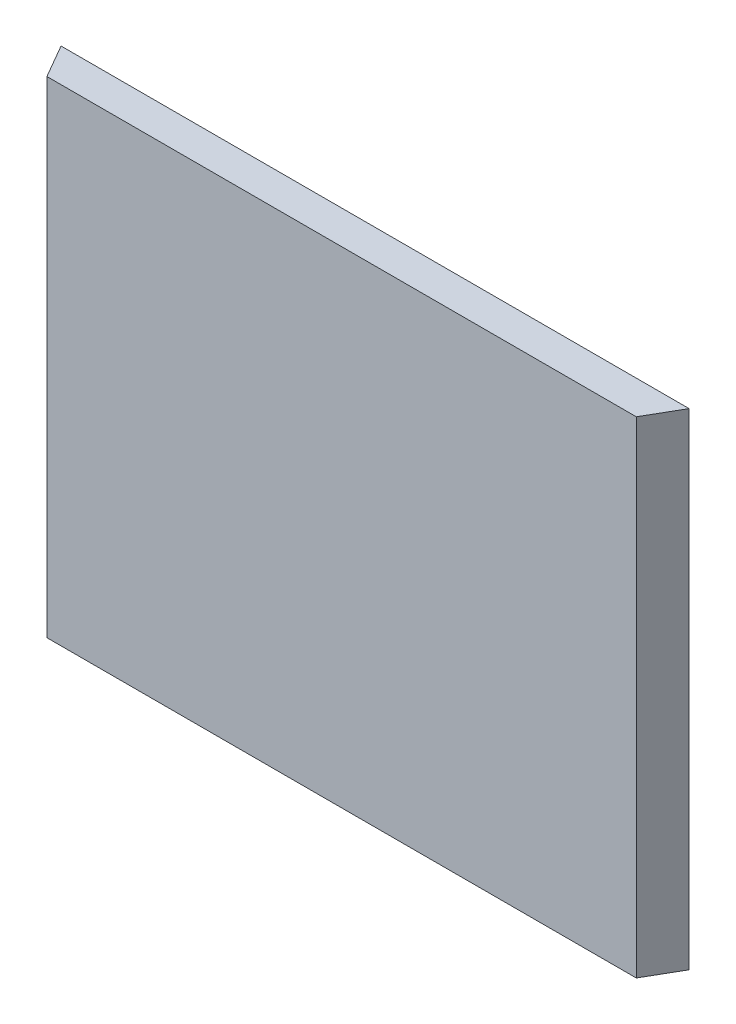
ISO-10303-21;
HEADER;
FILE_DESCRIPTION(('STEP AP214'),'2;1');
FILE_NAME('part.step','',(''),(''),'','','');
FILE_SCHEMA(('AUTOMOTIVE_DESIGN { 1 0 10303 214 1 1 1 1 }'));
ENDSEC;
DATA;
#1=APPLICATION_CONTEXT('core data for automotive mechanical design processes');
#2=APPLICATION_PROTOCOL_DEFINITION('international standard','automotive_design',2000,#1);
#3=PRODUCT_CONTEXT('',#1,'mechanical');
#4=PRODUCT('Part','Part','',(#3));
#5=PRODUCT_RELATED_PRODUCT_CATEGORY('part','',(#4));
#6=PRODUCT_DEFINITION_FORMATION('','',#4);
#7=PRODUCT_DEFINITION_CONTEXT('part definition',#1,'design');
#8=PRODUCT_DEFINITION('design','',#6,#7);
#9=PRODUCT_DEFINITION_SHAPE('','',#8);
#10=(LENGTH_UNIT() NAMED_UNIT(*) SI_UNIT(.MILLI.,.METRE.));
#11=(NAMED_UNIT(*) PLANE_ANGLE_UNIT() SI_UNIT($,.RADIAN.));
#12=(NAMED_UNIT(*) SI_UNIT($,.STERADIAN.) SOLID_ANGLE_UNIT());
#13=UNCERTAINTY_MEASURE_WITH_UNIT(LENGTH_MEASURE(1.E-05),#10,'distance_accuracy_value','');
#14=(GEOMETRIC_REPRESENTATION_CONTEXT(3) GLOBAL_UNCERTAINTY_ASSIGNED_CONTEXT((#13)) GLOBAL_UNIT_ASSIGNED_CONTEXT((#10,
#11,#12)) REPRESENTATION_CONTEXT('',''));
#15=CARTESIAN_POINT('',(0.,0.,0.));
#16=DIRECTION('',(0.,0.,1.));
#17=DIRECTION('',(1.,0.,0.));
#18=AXIS2_PLACEMENT_3D('',#15,#16,#17);
#19=CARTESIAN_POINT('',(0.,-0.254,0.341977363793));
#20=DIRECTION('',(0.,1.,0.));
#21=DIRECTION('',(0.,0.,-1.));
#22=AXIS2_PLACEMENT_3D('',#19,#20,#21);
#23=PLANE('',#22);
#24=DIRECTION('',(1.,0.,0.));
#25=VECTOR('',#24,1.);
#26=CARTESIAN_POINT('',(-0.328207259422,-0.254,0.325));
#27=LINE('',#26,#25);
#28=CARTESIAN_POINT('',(-0.328207259422,-0.254,0.325));
#29=VERTEX_POINT('',#28);
#30=CARTESIAN_POINT('',(0.328207259422,-0.254,0.325));
#31=VERTEX_POINT('',#30);
#32=EDGE_CURVE('E101',#29,#31,#27,.T.);
#33=ORIENTED_EDGE('',*,*,#32,.T.);
#34=DIRECTION('',(-0.50000000000019,0.,0.866025403784329));
#35=VECTOR('',#34,1.);
#36=CARTESIAN_POINT('',(0.328207259422,-0.254,0.325));
#37=LINE('',#36,#35);
#38=CARTESIAN_POINT('',(0.308,-0.254,0.36));
#39=VERTEX_POINT('',#38);
#40=EDGE_CURVE('E84',#31,#39,#37,.T.);
#41=ORIENTED_EDGE('',*,*,#40,.T.);
#42=DIRECTION('',(1.,0.,0.));
#43=VECTOR('',#42,1.);
#44=CARTESIAN_POINT('',(-0.308,-0.254,0.36));
#45=LINE('',#44,#43);
#46=CARTESIAN_POINT('',(-0.308,-0.254,0.36));
#47=VERTEX_POINT('',#46);
#48=EDGE_CURVE('E73',#47,#39,#45,.T.);
#49=ORIENTED_EDGE('',*,*,#48,.F.);
#50=DIRECTION('',(0.50000000000019,0.,0.866025403784329));
#51=VECTOR('',#50,1.);
#52=CARTESIAN_POINT('',(-0.328207259422,-0.254,0.325));
#53=LINE('',#52,#51);
#54=EDGE_CURVE('E11',#29,#47,#53,.T.);
#55=ORIENTED_EDGE('',*,*,#54,.F.);
#56=EDGE_LOOP('',(#33,#41,#49,#55));
#57=FACE_BOUND('',#56,.T.);
#58=ADVANCED_FACE('F17',(#57),#23,.F.);
#59=CARTESIAN_POINT('',(-0.328207259422,-0.254,0.325));
#60=DIRECTION('',(-0.866025403784329,0.,0.50000000000019));
#61=DIRECTION('',(0.,1.,0.));
#62=AXIS2_PLACEMENT_3D('',#59,#60,#61);
#63=PLANE('',#62);
#64=DIRECTION('',(0.,1.,0.));
#65=VECTOR('',#64,1.);
#66=CARTESIAN_POINT('',(-0.328207259422,-0.254,0.325));
#67=LINE('',#66,#65);
#68=CARTESIAN_POINT('',(-0.328207259422,0.254,0.325));
#69=VERTEX_POINT('',#68);
#70=EDGE_CURVE('E96',#29,#69,#67,.T.);
#71=ORIENTED_EDGE('',*,*,#70,.F.);
#72=ORIENTED_EDGE('',*,*,#54,.T.);
#73=DIRECTION('',(0.,1.,0.));
#74=VECTOR('',#73,1.);
#75=CARTESIAN_POINT('',(-0.308,-0.254,0.36));
#76=LINE('',#75,#74);
#77=CARTESIAN_POINT('',(-0.308,0.254,0.36));
#78=VERTEX_POINT('',#77);
#79=EDGE_CURVE('E83',#47,#78,#76,.T.);
#80=ORIENTED_EDGE('',*,*,#79,.T.);
#81=DIRECTION('',(0.50000000000019,0.,0.866025403784329));
#82=VECTOR('',#81,1.);
#83=CARTESIAN_POINT('',(-0.328207259422,0.254,0.325));
#84=LINE('',#83,#82);
#85=EDGE_CURVE('E28',#69,#78,#84,.T.);
#86=ORIENTED_EDGE('',*,*,#85,.F.);
#87=EDGE_LOOP('',(#71,#72,#80,#86));
#88=FACE_BOUND('',#87,.T.);
#89=ADVANCED_FACE('F138',(#88),#63,.T.);
#90=CARTESIAN_POINT('',(0.,0.254,0.341977363793));
#91=DIRECTION('',(0.,1.,0.));
#92=DIRECTION('',(0.,0.,-1.));
#93=AXIS2_PLACEMENT_3D('',#90,#91,#92);
#94=PLANE('',#93);
#95=ORIENTED_EDGE('',*,*,#85,.T.);
#96=DIRECTION('',(1.,0.,0.));
#97=VECTOR('',#96,1.);
#98=CARTESIAN_POINT('',(-0.308,0.254,0.36));
#99=LINE('',#98,#97);
#100=CARTESIAN_POINT('',(0.308,0.254,0.36));
#101=VERTEX_POINT('',#100);
#102=EDGE_CURVE('E63',#78,#101,#99,.T.);
#103=ORIENTED_EDGE('',*,*,#102,.T.);
#104=DIRECTION('',(-0.50000000000019,0.,0.866025403784329));
#105=VECTOR('',#104,1.);
#106=CARTESIAN_POINT('',(0.328207259422,0.254,0.325));
#107=LINE('',#106,#105);
#108=CARTESIAN_POINT('',(0.328207259422,0.254,0.325));
#109=VERTEX_POINT('',#108);
#110=EDGE_CURVE('E66',#109,#101,#107,.T.);
#111=ORIENTED_EDGE('',*,*,#110,.F.);
#112=DIRECTION('',(1.,0.,0.));
#113=VECTOR('',#112,1.);
#114=CARTESIAN_POINT('',(-0.328207259422,0.254,0.325));
#115=LINE('',#114,#113);
#116=EDGE_CURVE('E21',#69,#109,#115,.T.);
#117=ORIENTED_EDGE('',*,*,#116,.F.);
#118=EDGE_LOOP('',(#95,#103,#111,#117));
#119=FACE_BOUND('',#118,.T.);
#120=ADVANCED_FACE('F65',(#119),#94,.T.);
#121=CARTESIAN_POINT('',(-0.308,-0.254,0.36));
#122=DIRECTION('',(0.,0.,1.));
#123=DIRECTION('',(0.,-1.,0.));
#124=AXIS2_PLACEMENT_3D('',#121,#122,#123);
#125=PLANE('',#124);
#126=ORIENTED_EDGE('',*,*,#79,.F.);
#127=ORIENTED_EDGE('',*,*,#48,.T.);
#128=DIRECTION('',(0.,1.,0.));
#129=VECTOR('',#128,1.);
#130=CARTESIAN_POINT('',(0.308,-0.254,0.36));
#131=LINE('',#130,#129);
#132=EDGE_CURVE('E79',#39,#101,#131,.T.);
#133=ORIENTED_EDGE('',*,*,#132,.T.);
#134=ORIENTED_EDGE('',*,*,#102,.F.);
#135=EDGE_LOOP('',(#126,#127,#133,#134));
#136=FACE_BOUND('',#135,.T.);
#137=ADVANCED_FACE('F19',(#136),#125,.T.);
#138=CARTESIAN_POINT('',(0.328207259422,-0.254,0.325));
#139=DIRECTION('',(0.866025403784329,0.,0.50000000000019));
#140=DIRECTION('',(0.,-1.,0.));
#141=AXIS2_PLACEMENT_3D('',#138,#139,#140);
#142=PLANE('',#141);
#143=ORIENTED_EDGE('',*,*,#132,.F.);
#144=ORIENTED_EDGE('',*,*,#40,.F.);
#145=DIRECTION('',(0.,1.,0.));
#146=VECTOR('',#145,1.);
#147=CARTESIAN_POINT('',(0.328207259422,-0.254,0.325));
#148=LINE('',#147,#146);
#149=EDGE_CURVE('E81',#31,#109,#148,.T.);
#150=ORIENTED_EDGE('',*,*,#149,.T.);
#151=ORIENTED_EDGE('',*,*,#110,.T.);
#152=EDGE_LOOP('',(#143,#144,#150,#151));
#153=FACE_BOUND('',#152,.T.);
#154=ADVANCED_FACE('F78',(#153),#142,.T.);
#155=CARTESIAN_POINT('',(-0.328207259422,-0.254,0.325));
#156=DIRECTION('',(0.,0.,-1.));
#157=DIRECTION('',(0.,-1.,0.));
#158=AXIS2_PLACEMENT_3D('',#155,#156,#157);
#159=PLANE('',#158);
#160=ORIENTED_EDGE('',*,*,#149,.F.);
#161=ORIENTED_EDGE('',*,*,#32,.F.);
#162=ORIENTED_EDGE('',*,*,#70,.T.);
#163=ORIENTED_EDGE('',*,*,#116,.T.);
#164=EDGE_LOOP('',(#160,#161,#162,#163));
#165=FACE_BOUND('',#164,.T.);
#166=ADVANCED_FACE('F169',(#165),#159,.T.);
#167=CLOSED_SHELL('',(#58,#89,#120,#137,#154,#166));
#168=MANIFOLD_SOLID_BREP('B1',#167);
#169=ADVANCED_BREP_SHAPE_REPRESENTATION('',(#18,#168),#14);
#170=SHAPE_DEFINITION_REPRESENTATION(#9,#169);
ENDSEC;
END-ISO-10303-21;
